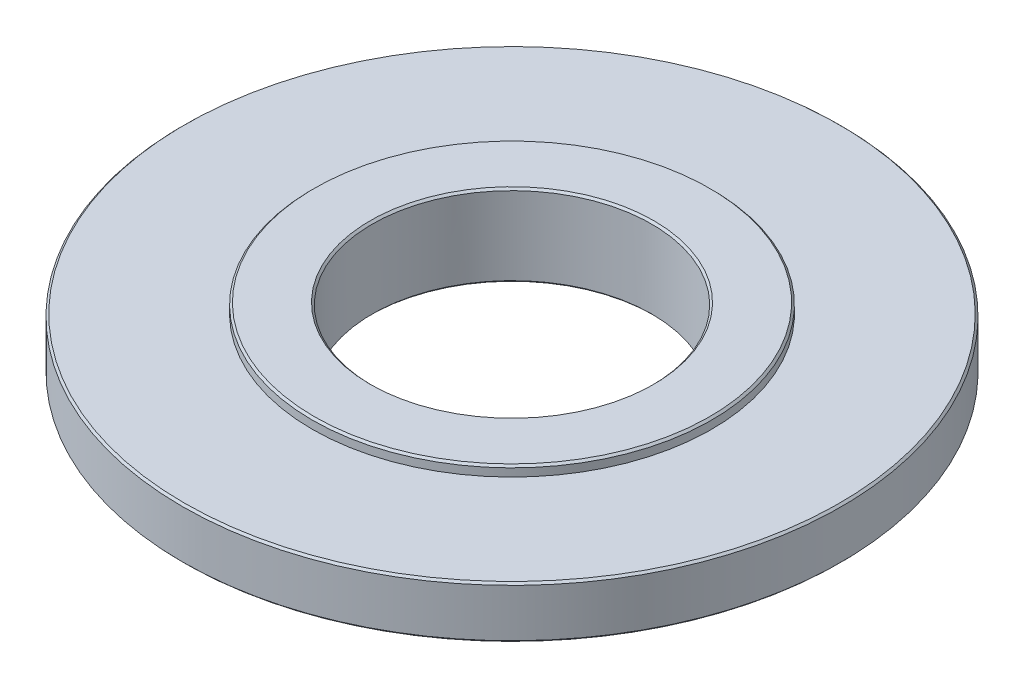
ISO-10303-21;
HEADER;
FILE_DESCRIPTION(('STEP AP214'),'2;1');
FILE_NAME('part.step','',(''),(''),'','','');
FILE_SCHEMA(('AUTOMOTIVE_DESIGN { 1 0 10303 214 1 1 1 1 }'));
ENDSEC;
DATA;
#1=APPLICATION_CONTEXT('core data for automotive mechanical design processes');
#2=APPLICATION_PROTOCOL_DEFINITION('international standard','automotive_design',2000,#1);
#3=PRODUCT_CONTEXT('',#1,'mechanical');
#4=PRODUCT('Part','Part','',(#3));
#5=PRODUCT_RELATED_PRODUCT_CATEGORY('part','',(#4));
#6=PRODUCT_DEFINITION_FORMATION('','',#4);
#7=PRODUCT_DEFINITION_CONTEXT('part definition',#1,'design');
#8=PRODUCT_DEFINITION('design','',#6,#7);
#9=PRODUCT_DEFINITION_SHAPE('','',#8);
#10=(LENGTH_UNIT() NAMED_UNIT(*) SI_UNIT(.MILLI.,.METRE.));
#11=(NAMED_UNIT(*) PLANE_ANGLE_UNIT() SI_UNIT($,.RADIAN.));
#12=(NAMED_UNIT(*) SI_UNIT($,.STERADIAN.) SOLID_ANGLE_UNIT());
#13=UNCERTAINTY_MEASURE_WITH_UNIT(LENGTH_MEASURE(1.E-05),#10,'distance_accuracy_value','');
#14=(GEOMETRIC_REPRESENTATION_CONTEXT(3) GLOBAL_UNCERTAINTY_ASSIGNED_CONTEXT((#13)) GLOBAL_UNIT_ASSIGNED_CONTEXT((#10,
#11,#12)) REPRESENTATION_CONTEXT('',''));
#15=CARTESIAN_POINT('',(0.,0.,0.));
#16=DIRECTION('',(0.,0.,1.));
#17=DIRECTION('',(1.,0.,0.));
#18=AXIS2_PLACEMENT_3D('',#15,#16,#17);
#19=CARTESIAN_POINT('',(0.,7.,0.));
#20=DIRECTION('',(0.,1.,0.));
#21=DIRECTION('',(0.,0.,1.));
#22=AXIS2_PLACEMENT_3D('',#19,#20,#21);
#23=CYLINDRICAL_SURFACE('',#22,82.5);
#24=CARTESIAN_POINT('',(0.,7.50000000044881,0.));
#25=DIRECTION('',(0.,-1.,0.));
#26=DIRECTION('',(0.,0.,-1.));
#27=AXIS2_PLACEMENT_3D('',#24,#25,#26);
#28=CIRCLE('',#27,82.5);
#29=CARTESIAN_POINT('',(0.,7.50000000044881,-82.5));
#30=VERTEX_POINT('',#29);
#31=EDGE_CURVE('E78',#30,#30,#28,.F.);
#32=ORIENTED_EDGE('',*,*,#31,.T.);
#33=EDGE_LOOP('',(#32));
#34=FACE_BOUND('',#33,.T.);
#35=CARTESIAN_POINT('',(0.,19.5000000004486,0.));
#36=DIRECTION('',(0.,1.,0.));
#37=DIRECTION('',(0.,0.,1.));
#38=AXIS2_PLACEMENT_3D('',#35,#36,#37);
#39=CIRCLE('',#38,82.5);
#40=CARTESIAN_POINT('',(0.,19.5000000004486,82.5));
#41=VERTEX_POINT('',#40);
#42=EDGE_CURVE('E81',#41,#41,#39,.F.);
#43=ORIENTED_EDGE('',*,*,#42,.T.);
#44=EDGE_LOOP('',(#43));
#45=FACE_BOUND('',#44,.T.);
#46=ADVANCED_FACE('F39',(#34,#45),#23,.T.);
#47=CARTESIAN_POINT('',(82.5,7.,0.));
#48=DIRECTION('',(0.,-1.,0.));
#49=DIRECTION('',(0.,0.,-1.));
#50=AXIS2_PLACEMENT_3D('',#47,#48,#49);
#51=PLANE('',#50);
#52=CARTESIAN_POINT('',(0.,7.,0.));
#53=DIRECTION('',(0.,-1.,0.));
#54=DIRECTION('',(0.,0.,-1.));
#55=AXIS2_PLACEMENT_3D('',#52,#53,#54);
#56=CIRCLE('',#55,82.0000000004486);
#57=CARTESIAN_POINT('',(0.,7.,-82.0000000004486));
#58=VERTEX_POINT('',#57);
#59=EDGE_CURVE('E75',#58,#58,#56,.T.);
#60=ORIENTED_EDGE('',*,*,#59,.T.);
#61=EDGE_LOOP('',(#60));
#62=FACE_BOUND('',#61,.T.);
#63=CARTESIAN_POINT('',(0.,7.,0.));
#64=DIRECTION('',(0.,-1.,0.));
#65=DIRECTION('',(0.,0.,-1.));
#66=AXIS2_PLACEMENT_3D('',#63,#64,#65);
#67=CIRCLE('',#66,70.);
#68=CARTESIAN_POINT('',(0.,7.,-70.));
#69=VERTEX_POINT('',#68);
#70=EDGE_CURVE('E85',#69,#69,#67,.T.);
#71=ORIENTED_EDGE('',*,*,#70,.F.);
#72=EDGE_LOOP('',(#71));
#73=FACE_BOUND('',#72,.T.);
#74=ADVANCED_FACE('F96',(#62,#73),#51,.T.);
#75=CARTESIAN_POINT('',(0.,20.,0.));
#76=DIRECTION('',(0.,1.,0.));
#77=DIRECTION('',(0.,0.,1.));
#78=AXIS2_PLACEMENT_3D('',#75,#76,#77);
#79=PLANE('',#78);
#80=CARTESIAN_POINT('',(0.,20.,0.));
#81=DIRECTION('',(0.,1.,0.));
#82=DIRECTION('',(0.,0.,1.));
#83=AXIS2_PLACEMENT_3D('',#80,#81,#82);
#84=CIRCLE('',#83,81.9999999995512);
#85=CARTESIAN_POINT('',(0.,20.,81.9999999995512));
#86=VERTEX_POINT('',#85);
#87=EDGE_CURVE('E72',#86,#86,#84,.T.);
#88=ORIENTED_EDGE('',*,*,#87,.T.);
#89=EDGE_LOOP('',(#88));
#90=FACE_BOUND('',#89,.T.);
#91=CARTESIAN_POINT('',(0.,20.,0.));
#92=DIRECTION('',(0.,1.,0.));
#93=DIRECTION('',(0.,0.,1.));
#94=AXIS2_PLACEMENT_3D('',#91,#92,#93);
#95=CIRCLE('',#94,50.);
#96=CARTESIAN_POINT('',(0.,20.,50.));
#97=VERTEX_POINT('',#96);
#98=EDGE_CURVE('E84',#97,#97,#95,.T.);
#99=ORIENTED_EDGE('',*,*,#98,.F.);
#100=EDGE_LOOP('',(#99));
#101=FACE_BOUND('',#100,.T.);
#102=ADVANCED_FACE('F93',(#90,#101),#79,.T.);
#103=CARTESIAN_POINT('',(0.,2.00000000000003,0.));
#104=DIRECTION('',(0.,1.,0.));
#105=DIRECTION('',(0.,0.,1.));
#106=AXIS2_PLACEMENT_3D('',#103,#104,#105);
#107=CYLINDRICAL_SURFACE('',#106,70.);
#108=CARTESIAN_POINT('',(0.,2.4999999995514,0.));
#109=DIRECTION('',(0.,-1.,0.));
#110=DIRECTION('',(0.,0.,-1.));
#111=AXIS2_PLACEMENT_3D('',#108,#109,#110);
#112=CIRCLE('',#111,70.);
#113=CARTESIAN_POINT('',(0.,2.4999999995514,-70.));
#114=VERTEX_POINT('',#113);
#115=EDGE_CURVE('E51',#114,#114,#112,.F.);
#116=ORIENTED_EDGE('',*,*,#115,.T.);
#117=EDGE_LOOP('',(#116));
#118=FACE_BOUND('',#117,.T.);
#119=ORIENTED_EDGE('',*,*,#70,.T.);
#120=EDGE_LOOP('',(#119));
#121=FACE_BOUND('',#120,.T.);
#122=ADVANCED_FACE('F95',(#118,#121),#107,.T.);
#123=CARTESIAN_POINT('',(0.,2.00000000000003,0.));
#124=DIRECTION('',(0.,-1.,0.));
#125=DIRECTION('',(0.,0.,-1.));
#126=AXIS2_PLACEMENT_3D('',#123,#124,#125);
#127=PLANE('',#126);
#128=CARTESIAN_POINT('',(0.,2.00000000000003,0.));
#129=DIRECTION('',(0.,-1.,0.));
#130=DIRECTION('',(0.,0.,-1.));
#131=AXIS2_PLACEMENT_3D('',#128,#129,#130);
#132=CIRCLE('',#131,69.4999999995512);
#133=CARTESIAN_POINT('',(0.,2.00000000000003,-69.4999999995512));
#134=VERTEX_POINT('',#133);
#135=EDGE_CURVE('E55',#134,#134,#132,.T.);
#136=ORIENTED_EDGE('',*,*,#135,.T.);
#137=EDGE_LOOP('',(#136));
#138=FACE_BOUND('',#137,.T.);
#139=CARTESIAN_POINT('',(0.,2.00000000000003,0.));
#140=DIRECTION('',(0.,-1.,0.));
#141=DIRECTION('',(0.,0.,-1.));
#142=AXIS2_PLACEMENT_3D('',#139,#140,#141);
#143=CIRCLE('',#142,35.5000000004488);
#144=CARTESIAN_POINT('',(0.,2.00000000000003,-35.5000000004488));
#145=VERTEX_POINT('',#144);
#146=EDGE_CURVE('E60',#145,#145,#143,.F.);
#147=ORIENTED_EDGE('',*,*,#146,.T.);
#148=EDGE_LOOP('',(#147));
#149=FACE_BOUND('',#148,.T.);
#150=ADVANCED_FACE('F103',(#138,#149),#127,.T.);
#151=CARTESIAN_POINT('',(0.,22.5,0.));
#152=DIRECTION('',(0.,-1.,0.));
#153=DIRECTION('',(0.,0.,-1.));
#154=AXIS2_PLACEMENT_3D('',#151,#152,#153);
#155=CYLINDRICAL_SURFACE('',#154,50.);
#156=CARTESIAN_POINT('',(0.,22.0000000004487,0.));
#157=DIRECTION('',(0.,1.,0.));
#158=DIRECTION('',(0.,0.,1.));
#159=AXIS2_PLACEMENT_3D('',#156,#157,#158);
#160=CIRCLE('',#159,50.);
#161=CARTESIAN_POINT('',(0.,22.0000000004487,50.));
#162=VERTEX_POINT('',#161);
#163=EDGE_CURVE('E63',#162,#162,#160,.F.);
#164=ORIENTED_EDGE('',*,*,#163,.T.);
#165=EDGE_LOOP('',(#164));
#166=FACE_BOUND('',#165,.T.);
#167=ORIENTED_EDGE('',*,*,#98,.T.);
#168=EDGE_LOOP('',(#167));
#169=FACE_BOUND('',#168,.T.);
#170=ADVANCED_FACE('F91',(#166,#169),#155,.T.);
#171=CARTESIAN_POINT('',(0.,22.5,0.));
#172=DIRECTION('',(0.,1.,0.));
#173=DIRECTION('',(0.,0.,1.));
#174=AXIS2_PLACEMENT_3D('',#171,#172,#173);
#175=PLANE('',#174);
#176=CARTESIAN_POINT('',(0.,22.5,0.));
#177=DIRECTION('',(0.,1.,0.));
#178=DIRECTION('',(0.,0.,1.));
#179=AXIS2_PLACEMENT_3D('',#176,#177,#178);
#180=CIRCLE('',#179,49.4999999995512);
#181=CARTESIAN_POINT('',(0.,22.5,49.4999999995512));
#182=VERTEX_POINT('',#181);
#183=EDGE_CURVE('E66',#182,#182,#180,.T.);
#184=ORIENTED_EDGE('',*,*,#183,.T.);
#185=EDGE_LOOP('',(#184));
#186=FACE_BOUND('',#185,.T.);
#187=CARTESIAN_POINT('',(0.,22.5,0.));
#188=DIRECTION('',(0.,1.,0.));
#189=DIRECTION('',(0.,0.,1.));
#190=AXIS2_PLACEMENT_3D('',#187,#188,#189);
#191=CIRCLE('',#190,35.4999999995514);
#192=CARTESIAN_POINT('',(0.,22.5,35.4999999995514));
#193=VERTEX_POINT('',#192);
#194=EDGE_CURVE('E69',#193,#193,#191,.F.);
#195=ORIENTED_EDGE('',*,*,#194,.T.);
#196=EDGE_LOOP('',(#195));
#197=FACE_BOUND('',#196,.T.);
#198=ADVANCED_FACE('F162',(#186,#197),#175,.T.);
#199=CARTESIAN_POINT('',(0.,22.5,0.));
#200=DIRECTION('',(0.,1.,0.));
#201=DIRECTION('',(0.,0.,1.));
#202=AXIS2_PLACEMENT_3D('',#199,#200,#201);
#203=CYLINDRICAL_SURFACE('',#202,35.);
#204=CARTESIAN_POINT('',(0.,2.49999999955135,0.));
#205=DIRECTION('',(0.,-1.,0.));
#206=DIRECTION('',(0.,0.,-1.));
#207=AXIS2_PLACEMENT_3D('',#204,#205,#206);
#208=CIRCLE('',#207,35.);
#209=CARTESIAN_POINT('',(0.,2.49999999955135,-35.));
#210=VERTEX_POINT('',#209);
#211=EDGE_CURVE('E10',#210,#210,#208,.T.);
#212=ORIENTED_EDGE('',*,*,#211,.T.);
#213=EDGE_LOOP('',(#212));
#214=FACE_BOUND('',#213,.T.);
#215=CARTESIAN_POINT('',(0.,21.9999999995512,0.));
#216=DIRECTION('',(0.,1.,0.));
#217=DIRECTION('',(0.,0.,1.));
#218=AXIS2_PLACEMENT_3D('',#215,#216,#217);
#219=CIRCLE('',#218,35.);
#220=CARTESIAN_POINT('',(0.,21.9999999995512,35.));
#221=VERTEX_POINT('',#220);
#222=EDGE_CURVE('E47',#221,#221,#219,.T.);
#223=ORIENTED_EDGE('',*,*,#222,.T.);
#224=EDGE_LOOP('',(#223));
#225=FACE_BOUND('',#224,.T.);
#226=ADVANCED_FACE('F123',(#214,#225),#203,.F.);
#227=CARTESIAN_POINT('',(0.,7.50000000044881,0.));
#228=DIRECTION('',(0.,1.,0.));
#229=DIRECTION('',(0.,0.,1.));
#230=AXIS2_PLACEMENT_3D('',#227,#228,#229);
#231=CONICAL_SURFACE('',#230,82.5,0.785398162500027);
#232=ORIENTED_EDGE('',*,*,#59,.F.);
#233=EDGE_LOOP('',(#232));
#234=FACE_BOUND('',#233,.T.);
#235=ORIENTED_EDGE('',*,*,#31,.F.);
#236=EDGE_LOOP('',(#235));
#237=FACE_BOUND('',#236,.T.);
#238=ADVANCED_FACE('F116',(#234,#237),#231,.T.);
#239=CARTESIAN_POINT('',(0.,20.,0.));
#240=DIRECTION('',(0.,-1.,0.));
#241=DIRECTION('',(0.,0.,-1.));
#242=AXIS2_PLACEMENT_3D('',#239,#240,#241);
#243=CONICAL_SURFACE('',#242,81.9999999995512,0.785398164294883);
#244=ORIENTED_EDGE('',*,*,#42,.F.);
#245=EDGE_LOOP('',(#244));
#246=FACE_BOUND('',#245,.T.);
#247=ORIENTED_EDGE('',*,*,#87,.F.);
#248=EDGE_LOOP('',(#247));
#249=FACE_BOUND('',#248,.T.);
#250=ADVANCED_FACE('F122',(#246,#249),#243,.T.);
#251=CARTESIAN_POINT('',(0.,22.5,0.));
#252=DIRECTION('',(0.,-1.,0.));
#253=DIRECTION('',(0.,0.,-1.));
#254=AXIS2_PLACEMENT_3D('',#251,#252,#253);
#255=CONICAL_SURFACE('',#254,49.4999999995512,0.785398164294904);
#256=ORIENTED_EDGE('',*,*,#163,.F.);
#257=EDGE_LOOP('',(#256));
#258=FACE_BOUND('',#257,.T.);
#259=ORIENTED_EDGE('',*,*,#183,.F.);
#260=EDGE_LOOP('',(#259));
#261=FACE_BOUND('',#260,.T.);
#262=ADVANCED_FACE('F130',(#258,#261),#255,.T.);
#263=CARTESIAN_POINT('',(0.,2.00000000000003,0.));
#264=DIRECTION('',(0.,1.,0.));
#265=DIRECTION('',(0.,0.,1.));
#266=AXIS2_PLACEMENT_3D('',#263,#264,#265);
#267=CONICAL_SURFACE('',#266,69.4999999995512,0.785398164294855);
#268=ORIENTED_EDGE('',*,*,#115,.F.);
#269=EDGE_LOOP('',(#268));
#270=FACE_BOUND('',#269,.T.);
#271=ORIENTED_EDGE('',*,*,#135,.F.);
#272=EDGE_LOOP('',(#271));
#273=FACE_BOUND('',#272,.T.);
#274=ADVANCED_FACE('F137',(#270,#273),#267,.T.);
#275=CARTESIAN_POINT('',(0.,2.00000000000003,0.));
#276=DIRECTION('',(0.,-1.,0.));
#277=DIRECTION('',(0.,0.,-1.));
#278=AXIS2_PLACEMENT_3D('',#275,#276,#277);
#279=CONICAL_SURFACE('',#278,35.5000000004488,0.78539816429489);
#280=ORIENTED_EDGE('',*,*,#211,.F.);
#281=EDGE_LOOP('',(#280));
#282=FACE_BOUND('',#281,.T.);
#283=ORIENTED_EDGE('',*,*,#146,.F.);
#284=EDGE_LOOP('',(#283));
#285=FACE_BOUND('',#284,.T.);
#286=ADVANCED_FACE('F143',(#282,#285),#279,.F.);
#287=CARTESIAN_POINT('',(0.,21.9999999995512,0.));
#288=DIRECTION('',(0.,1.,0.));
#289=DIRECTION('',(0.,0.,1.));
#290=AXIS2_PLACEMENT_3D('',#287,#288,#289);
#291=CONICAL_SURFACE('',#290,35.,0.785398162500027);
#292=ORIENTED_EDGE('',*,*,#194,.F.);
#293=EDGE_LOOP('',(#292));
#294=FACE_BOUND('',#293,.T.);
#295=ORIENTED_EDGE('',*,*,#222,.F.);
#296=EDGE_LOOP('',(#295));
#297=FACE_BOUND('',#296,.T.);
#298=ADVANCED_FACE('F42',(#294,#297),#291,.F.);
#299=CLOSED_SHELL('',(#46,#74,#102,#122,#150,#170,#198,#226,#238,#250,#262,#274,#286,#298));
#300=MANIFOLD_SOLID_BREP('B2',#299);
#301=ADVANCED_BREP_SHAPE_REPRESENTATION('',(#18,#300),#14);
#302=SHAPE_DEFINITION_REPRESENTATION(#9,#301);
ENDSEC;
END-ISO-10303-21;
